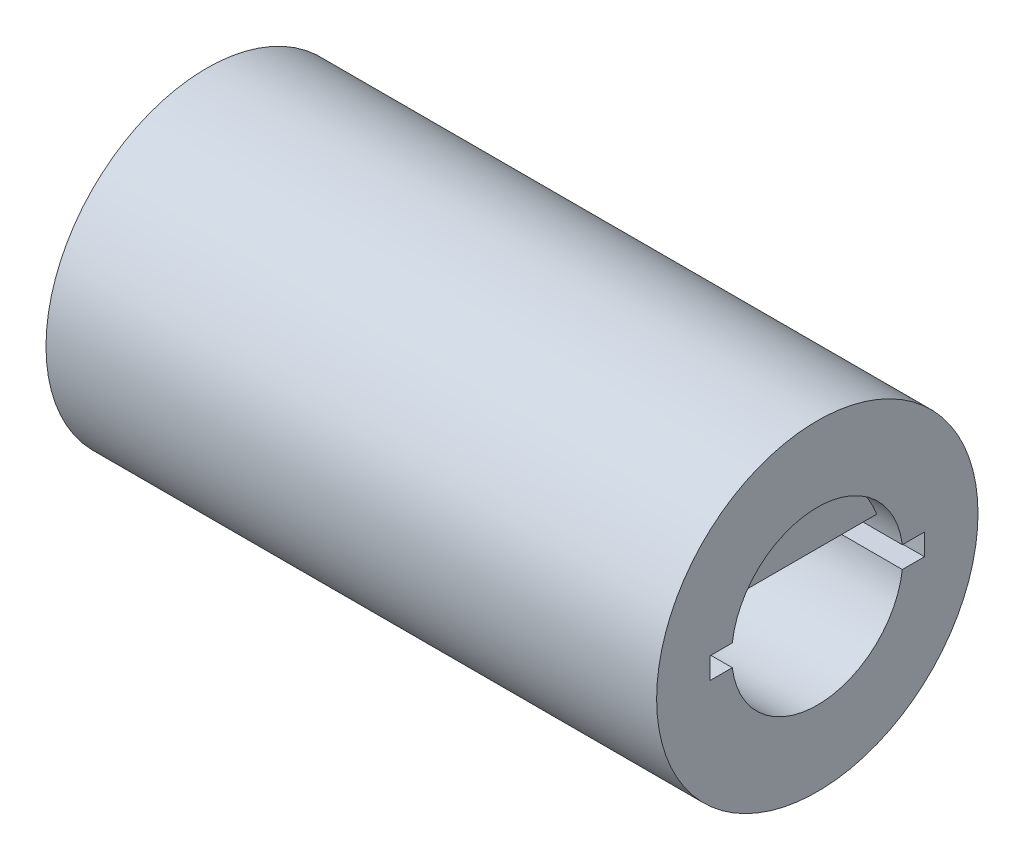
ISO-10303-21;
HEADER;
FILE_DESCRIPTION(('STEP AP214'),'2;1');
FILE_NAME('part.step','',(''),(''),'','','');
FILE_SCHEMA(('AUTOMOTIVE_DESIGN { 1 0 10303 214 1 1 1 1 }'));
ENDSEC;
DATA;
#1=APPLICATION_CONTEXT('core data for automotive mechanical design processes');
#2=APPLICATION_PROTOCOL_DEFINITION('international standard','automotive_design',2000,#1);
#3=PRODUCT_CONTEXT('',#1,'mechanical');
#4=PRODUCT('Part','Part','',(#3));
#5=PRODUCT_RELATED_PRODUCT_CATEGORY('part','',(#4));
#6=PRODUCT_DEFINITION_FORMATION('','',#4);
#7=PRODUCT_DEFINITION_CONTEXT('part definition',#1,'design');
#8=PRODUCT_DEFINITION('design','',#6,#7);
#9=PRODUCT_DEFINITION_SHAPE('','',#8);
#10=(LENGTH_UNIT() NAMED_UNIT(*) SI_UNIT(.MILLI.,.METRE.));
#11=(NAMED_UNIT(*) PLANE_ANGLE_UNIT() SI_UNIT($,.RADIAN.));
#12=(NAMED_UNIT(*) SI_UNIT($,.STERADIAN.) SOLID_ANGLE_UNIT());
#13=UNCERTAINTY_MEASURE_WITH_UNIT(LENGTH_MEASURE(1.E-05),#10,'distance_accuracy_value','');
#14=(GEOMETRIC_REPRESENTATION_CONTEXT(3) GLOBAL_UNCERTAINTY_ASSIGNED_CONTEXT((#13)) GLOBAL_UNIT_ASSIGNED_CONTEXT((#10,
#11,#12)) REPRESENTATION_CONTEXT('',''));
#15=CARTESIAN_POINT('',(0.,0.,0.));
#16=DIRECTION('',(0.,0.,1.));
#17=DIRECTION('',(1.,0.,0.));
#18=AXIS2_PLACEMENT_3D('',#15,#16,#17);
#19=CARTESIAN_POINT('',(8.,0.,0.));
#20=DIRECTION('',(-1.,0.,0.));
#21=DIRECTION('',(0.,0.,1.));
#22=AXIS2_PLACEMENT_3D('',#19,#20,#21);
#23=CYLINDRICAL_SURFACE('',#22,4.);
#24=DIRECTION('',(-1.,0.,0.));
#25=VECTOR('',#24,1.);
#26=CARTESIAN_POINT('',(8.,0.5,-3.96862696659689));
#27=LINE('',#26,#25);
#28=CARTESIAN_POINT('',(8.,0.5,-3.96862696659689));
#29=VERTEX_POINT('',#28);
#30=CARTESIAN_POINT('',(0.,0.5,-3.96862696659689));
#31=VERTEX_POINT('',#30);
#32=EDGE_CURVE('E262',#29,#31,#27,.T.);
#33=ORIENTED_EDGE('',*,*,#32,.F.);
#34=CARTESIAN_POINT('',(8.,0.,0.));
#35=DIRECTION('',(1.,0.,0.));
#36=DIRECTION('',(0.,0.,-1.));
#37=AXIS2_PLACEMENT_3D('',#34,#35,#36);
#38=CIRCLE('',#37,4.);
#39=CARTESIAN_POINT('',(8.,0.5,3.96862696659689));
#40=VERTEX_POINT('',#39);
#41=EDGE_CURVE('E333',#29,#40,#38,.T.);
#42=ORIENTED_EDGE('',*,*,#41,.T.);
#43=DIRECTION('',(-1.,0.,0.));
#44=VECTOR('',#43,1.);
#45=CARTESIAN_POINT('',(8.,0.5,3.96862696659689));
#46=LINE('',#45,#44);
#47=CARTESIAN_POINT('',(0.,0.5,3.96862696659689));
#48=VERTEX_POINT('',#47);
#49=EDGE_CURVE('E260',#48,#40,#46,.F.);
#50=ORIENTED_EDGE('',*,*,#49,.F.);
#51=CARTESIAN_POINT('',(0.,0.,0.));
#52=DIRECTION('',(1.,0.,0.));
#53=DIRECTION('',(0.,0.,-1.));
#54=AXIS2_PLACEMENT_3D('',#51,#52,#53);
#55=CIRCLE('',#54,4.);
#56=CARTESIAN_POINT('',(0.,1.33333333333333,3.77123616632825));
#57=VERTEX_POINT('',#56);
#58=EDGE_CURVE('E235',#57,#48,#55,.T.);
#59=ORIENTED_EDGE('',*,*,#58,.F.);
#60=DIRECTION('',(-1.,0.,0.));
#61=VECTOR('',#60,1.);
#62=CARTESIAN_POINT('',(7.,1.33333333333333,3.77123616632825));
#63=LINE('',#62,#61);
#64=CARTESIAN_POINT('',(7.,1.33333333333333,3.77123616632825));
#65=VERTEX_POINT('',#64);
#66=EDGE_CURVE('E329',#65,#57,#63,.T.);
#67=ORIENTED_EDGE('',*,*,#66,.F.);
#68=CARTESIAN_POINT('',(7.,0.,0.));
#69=DIRECTION('',(1.,0.,0.));
#70=DIRECTION('',(0.,0.,-1.));
#71=AXIS2_PLACEMENT_3D('',#68,#69,#70);
#72=CIRCLE('',#71,4.);
#73=CARTESIAN_POINT('',(7.,1.33333333333333,-3.77123616632825));
#74=VERTEX_POINT('',#73);
#75=EDGE_CURVE('E318',#74,#65,#72,.T.);
#76=ORIENTED_EDGE('',*,*,#75,.F.);
#77=DIRECTION('',(-1.,0.,0.));
#78=VECTOR('',#77,1.);
#79=CARTESIAN_POINT('',(7.,1.33333333333333,-3.77123616632825));
#80=LINE('',#79,#78);
#81=CARTESIAN_POINT('',(0.,1.33333333333333,-3.77123616632825));
#82=VERTEX_POINT('',#81);
#83=EDGE_CURVE('E324',#74,#82,#80,.T.);
#84=ORIENTED_EDGE('',*,*,#83,.T.);
#85=EDGE_CURVE('E332',#31,#82,#55,.T.);
#86=ORIENTED_EDGE('',*,*,#85,.F.);
#87=EDGE_LOOP('',(#33,#42,#50,#59,#67,#76,#84,#86));
#88=FACE_BOUND('',#87,.T.);
#89=ADVANCED_FACE('F40',(#88),#23,.F.);
#90=CARTESIAN_POINT('',(-18.5,0.,0.));
#91=DIRECTION('',(1.,0.,0.));
#92=DIRECTION('',(0.,0.,-1.));
#93=AXIS2_PLACEMENT_3D('',#90,#91,#92);
#94=CYLINDRICAL_SURFACE('',#93,2.5);
#95=CARTESIAN_POINT('',(-1.,0.,0.));
#96=DIRECTION('',(-1.,0.,0.));
#97=DIRECTION('',(0.,0.,1.));
#98=AXIS2_PLACEMENT_3D('',#95,#96,#97);
#99=CIRCLE('',#98,2.5);
#100=CARTESIAN_POINT('',(-1.,-0.648148148148148,-2.41451940933431));
#101=VERTEX_POINT('',#100);
#102=CARTESIAN_POINT('',(-1.,-2.,-1.5));
#103=VERTEX_POINT('',#102);
#104=EDGE_CURVE('E301',#101,#103,#99,.T.);
#105=ORIENTED_EDGE('',*,*,#104,.F.);
#106=DIRECTION('',(1.,0.,0.));
#107=VECTOR('',#106,1.);
#108=CARTESIAN_POINT('',(-18.5,-0.648148148148148,-2.41451940933431));
#109=LINE('',#108,#107);
#110=CARTESIAN_POINT('',(-20.5,-0.648148148148148,-2.41451940933431));
#111=VERTEX_POINT('',#110);
#112=EDGE_CURVE('E350',#101,#111,#109,.F.);
#113=ORIENTED_EDGE('',*,*,#112,.T.);
#114=CARTESIAN_POINT('',(-20.5,0.,0.));
#115=DIRECTION('',(-1.,0.,0.));
#116=DIRECTION('',(0.,0.,1.));
#117=AXIS2_PLACEMENT_3D('',#114,#115,#116);
#118=CIRCLE('',#117,2.5);
#119=CARTESIAN_POINT('',(-20.5,-0.648148148148148,2.41451940933431));
#120=VERTEX_POINT('',#119);
#121=EDGE_CURVE('E296',#111,#120,#118,.T.);
#122=ORIENTED_EDGE('',*,*,#121,.T.);
#123=DIRECTION('',(1.,0.,0.));
#124=VECTOR('',#123,1.);
#125=CARTESIAN_POINT('',(-18.5,-0.648148148148148,2.41451940933431));
#126=LINE('',#125,#124);
#127=CARTESIAN_POINT('',(-1.,-0.648148148148148,2.41451940933431));
#128=VERTEX_POINT('',#127);
#129=EDGE_CURVE('E348',#120,#128,#126,.T.);
#130=ORIENTED_EDGE('',*,*,#129,.T.);
#131=CARTESIAN_POINT('',(-1.,-2.,1.5));
#132=VERTEX_POINT('',#131);
#133=EDGE_CURVE('E307',#132,#128,#99,.T.);
#134=ORIENTED_EDGE('',*,*,#133,.F.);
#135=DIRECTION('',(1.,0.,0.));
#136=VECTOR('',#135,1.);
#137=CARTESIAN_POINT('',(-18.5,-2.,1.5));
#138=LINE('',#137,#136);
#139=CARTESIAN_POINT('',(-18.5,-2.,1.5));
#140=VERTEX_POINT('',#139);
#141=EDGE_CURVE('E314',#140,#132,#138,.T.);
#142=ORIENTED_EDGE('',*,*,#141,.F.);
#143=CARTESIAN_POINT('',(-18.5,0.,0.));
#144=DIRECTION('',(-1.,0.,0.));
#145=DIRECTION('',(0.,0.,1.));
#146=AXIS2_PLACEMENT_3D('',#143,#144,#145);
#147=CIRCLE('',#146,2.5);
#148=CARTESIAN_POINT('',(-18.5,-2.,-1.5));
#149=VERTEX_POINT('',#148);
#150=EDGE_CURVE('E297',#149,#140,#147,.T.);
#151=ORIENTED_EDGE('',*,*,#150,.F.);
#152=DIRECTION('',(1.,0.,0.));
#153=VECTOR('',#152,1.);
#154=CARTESIAN_POINT('',(-18.5,-2.,-1.5));
#155=LINE('',#154,#153);
#156=EDGE_CURVE('E305',#149,#103,#155,.T.);
#157=ORIENTED_EDGE('',*,*,#156,.T.);
#158=EDGE_LOOP('',(#105,#113,#122,#130,#134,#142,#151,#157));
#159=FACE_BOUND('',#158,.T.);
#160=ADVANCED_FACE('F465',(#159),#94,.F.);
#161=DIRECTION('',(-1.,0.,0.));
#162=VECTOR('',#161,1.);
#163=CARTESIAN_POINT('',(8.,-0.5,3.96862696659689));
#164=LINE('',#163,#162);
#165=CARTESIAN_POINT('',(8.,-0.5,3.96862696659689));
#166=VERTEX_POINT('',#165);
#167=CARTESIAN_POINT('',(0.,-0.5,3.96862696659689));
#168=VERTEX_POINT('',#167);
#169=EDGE_CURVE('E258',#166,#168,#164,.T.);
#170=ORIENTED_EDGE('',*,*,#169,.F.);
#171=CARTESIAN_POINT('',(8.,-0.5,-3.96862696659689));
#172=VERTEX_POINT('',#171);
#173=EDGE_CURVE('E337',#166,#172,#38,.T.);
#174=ORIENTED_EDGE('',*,*,#173,.T.);
#175=DIRECTION('',(-1.,0.,0.));
#176=VECTOR('',#175,1.);
#177=CARTESIAN_POINT('',(8.,-0.5,-3.96862696659689));
#178=LINE('',#177,#176);
#179=CARTESIAN_POINT('',(0.,-0.5,-3.96862696659689));
#180=VERTEX_POINT('',#179);
#181=EDGE_CURVE('E255',#180,#172,#178,.F.);
#182=ORIENTED_EDGE('',*,*,#181,.F.);
#183=EDGE_CURVE('E339',#168,#180,#55,.T.);
#184=ORIENTED_EDGE('',*,*,#183,.F.);
#185=EDGE_LOOP('',(#170,#174,#182,#184));
#186=FACE_BOUND('',#185,.T.);
#187=ADVANCED_FACE('F443',(#186),#23,.F.);
#188=CARTESIAN_POINT('',(0.,0.,0.));
#189=DIRECTION('',(-1.,0.,0.));
#190=DIRECTION('',(0.,0.,1.));
#191=AXIS2_PLACEMENT_3D('',#188,#189,#190);
#192=PLANE('',#191);
#193=ORIENTED_EDGE('',*,*,#183,.T.);
#194=DIRECTION('',(0.,0.,-1.));
#195=VECTOR('',#194,1.);
#196=CARTESIAN_POINT('',(0.,-0.5,5.));
#197=LINE('',#196,#195);
#198=CARTESIAN_POINT('',(0.,-0.5,-5.));
#199=VERTEX_POINT('',#198);
#200=EDGE_CURVE('E435',#180,#199,#197,.T.);
#201=ORIENTED_EDGE('',*,*,#200,.T.);
#202=DIRECTION('',(0.,1.,0.));
#203=VECTOR('',#202,1.);
#204=CARTESIAN_POINT('',(0.,-0.5,-5.));
#205=LINE('',#204,#203);
#206=CARTESIAN_POINT('',(0.,0.5,-5.));
#207=VERTEX_POINT('',#206);
#208=EDGE_CURVE('E256',#199,#207,#205,.T.);
#209=ORIENTED_EDGE('',*,*,#208,.T.);
#210=DIRECTION('',(0.,0.,1.));
#211=VECTOR('',#210,1.);
#212=CARTESIAN_POINT('',(0.,0.5,5.));
#213=LINE('',#212,#211);
#214=EDGE_CURVE('E239',#207,#31,#213,.T.);
#215=ORIENTED_EDGE('',*,*,#214,.T.);
#216=ORIENTED_EDGE('',*,*,#85,.T.);
#217=DIRECTION('',(0.,0.,-1.));
#218=VECTOR('',#217,1.);
#219=CARTESIAN_POINT('',(0.,1.33333333333333,3.77123616632825));
#220=LINE('',#219,#218);
#221=EDGE_CURVE('E317',#57,#82,#220,.T.);
#222=ORIENTED_EDGE('',*,*,#221,.F.);
#223=ORIENTED_EDGE('',*,*,#58,.T.);
#224=CARTESIAN_POINT('',(0.,0.5,5.));
#225=VERTEX_POINT('',#224);
#226=EDGE_CURVE('E228',#48,#225,#213,.T.);
#227=ORIENTED_EDGE('',*,*,#226,.T.);
#228=DIRECTION('',(0.,-1.,0.));
#229=VECTOR('',#228,1.);
#230=CARTESIAN_POINT('',(0.,-0.5,5.));
#231=LINE('',#230,#229);
#232=CARTESIAN_POINT('',(0.,-0.5,5.));
#233=VERTEX_POINT('',#232);
#234=EDGE_CURVE('E233',#225,#233,#231,.T.);
#235=ORIENTED_EDGE('',*,*,#234,.T.);
#236=EDGE_CURVE('E434',#233,#168,#197,.T.);
#237=ORIENTED_EDGE('',*,*,#236,.T.);
#238=EDGE_LOOP('',(#193,#201,#209,#215,#216,#222,#223,#227,#235,#237));
#239=FACE_BOUND('',#238,.T.);
#240=ADVANCED_FACE('F231',(#239),#192,.F.);
#241=CARTESIAN_POINT('',(8.,0.,0.));
#242=DIRECTION('',(1.,0.,0.));
#243=DIRECTION('',(0.,0.,-1.));
#244=AXIS2_PLACEMENT_3D('',#241,#242,#243);
#245=PLANE('',#244);
#246=DIRECTION('',(0.,0.,1.));
#247=VECTOR('',#246,1.);
#248=CARTESIAN_POINT('',(8.,0.5,0.));
#249=LINE('',#248,#247);
#250=CARTESIAN_POINT('',(8.,0.5,5.));
#251=VERTEX_POINT('',#250);
#252=EDGE_CURVE('E12',#40,#251,#249,.T.);
#253=ORIENTED_EDGE('',*,*,#252,.F.);
#254=ORIENTED_EDGE('',*,*,#41,.F.);
#255=DIRECTION('',(0.,0.,1.));
#256=VECTOR('',#255,1.);
#257=CARTESIAN_POINT('',(8.,0.5,5.));
#258=LINE('',#257,#256);
#259=CARTESIAN_POINT('',(8.,0.5,-5.));
#260=VERTEX_POINT('',#259);
#261=EDGE_CURVE('E426',#260,#29,#258,.T.);
#262=ORIENTED_EDGE('',*,*,#261,.F.);
#263=DIRECTION('',(0.,1.,0.));
#264=VECTOR('',#263,1.);
#265=CARTESIAN_POINT('',(8.,-0.5,-5.));
#266=LINE('',#265,#264);
#267=CARTESIAN_POINT('',(8.,-0.5,-5.));
#268=VERTEX_POINT('',#267);
#269=EDGE_CURVE('E422',#268,#260,#266,.T.);
#270=ORIENTED_EDGE('',*,*,#269,.F.);
#271=DIRECTION('',(0.,0.,-1.));
#272=VECTOR('',#271,1.);
#273=CARTESIAN_POINT('',(8.,-0.5,0.));
#274=LINE('',#273,#272);
#275=EDGE_CURVE('E48',#172,#268,#274,.T.);
#276=ORIENTED_EDGE('',*,*,#275,.F.);
#277=ORIENTED_EDGE('',*,*,#173,.F.);
#278=DIRECTION('',(0.,0.,-1.));
#279=VECTOR('',#278,1.);
#280=CARTESIAN_POINT('',(8.,-0.5,5.));
#281=LINE('',#280,#279);
#282=CARTESIAN_POINT('',(8.,-0.5,5.));
#283=VERTEX_POINT('',#282);
#284=EDGE_CURVE('E240',#283,#166,#281,.T.);
#285=ORIENTED_EDGE('',*,*,#284,.F.);
#286=DIRECTION('',(0.,-1.,0.));
#287=VECTOR('',#286,1.);
#288=CARTESIAN_POINT('',(8.,-0.5,5.));
#289=LINE('',#288,#287);
#290=EDGE_CURVE('E55',#251,#283,#289,.T.);
#291=ORIENTED_EDGE('',*,*,#290,.F.);
#292=EDGE_LOOP('',(#253,#254,#262,#270,#276,#277,#285,#291));
#293=FACE_BOUND('',#292,.T.);
#294=CARTESIAN_POINT('',(8.,0.,0.));
#295=DIRECTION('',(1.,0.,0.));
#296=DIRECTION('',(0.,0.,-1.));
#297=AXIS2_PLACEMENT_3D('',#294,#295,#296);
#298=CIRCLE('',#297,7.5);
#299=CARTESIAN_POINT('',(8.,0.,-7.5));
#300=VERTEX_POINT('',#299);
#301=EDGE_CURVE('E336',#300,#300,#298,.T.);
#302=ORIENTED_EDGE('',*,*,#301,.T.);
#303=EDGE_LOOP('',(#302));
#304=FACE_BOUND('',#303,.T.);
#305=ADVANCED_FACE('F423',(#293,#304),#245,.T.);
#306=CARTESIAN_POINT('',(8.,0.,0.));
#307=DIRECTION('',(-1.,0.,0.));
#308=DIRECTION('',(0.,0.,1.));
#309=AXIS2_PLACEMENT_3D('',#306,#307,#308);
#310=CYLINDRICAL_SURFACE('',#309,7.5);
#311=ORIENTED_EDGE('',*,*,#301,.F.);
#312=EDGE_LOOP('',(#311));
#313=FACE_BOUND('',#312,.T.);
#314=CARTESIAN_POINT('',(-20.5,0.,0.));
#315=DIRECTION('',(-1.,0.,0.));
#316=DIRECTION('',(0.,0.,1.));
#317=AXIS2_PLACEMENT_3D('',#314,#315,#316);
#318=CIRCLE('',#317,7.5);
#319=CARTESIAN_POINT('',(-20.5,0.,7.5));
#320=VERTEX_POINT('',#319);
#321=EDGE_CURVE('E295',#320,#320,#318,.T.);
#322=ORIENTED_EDGE('',*,*,#321,.F.);
#323=EDGE_LOOP('',(#322));
#324=FACE_BOUND('',#323,.T.);
#325=ADVANCED_FACE('F481',(#313,#324),#310,.T.);
#326=CARTESIAN_POINT('',(7.,1.33333333333333,3.77123616632825));
#327=DIRECTION('',(0.,1.,0.));
#328=DIRECTION('',(0.,0.,1.));
#329=AXIS2_PLACEMENT_3D('',#326,#327,#328);
#330=PLANE('',#329);
#331=ORIENTED_EDGE('',*,*,#221,.T.);
#332=ORIENTED_EDGE('',*,*,#83,.F.);
#333=DIRECTION('',(0.,0.,-1.));
#334=VECTOR('',#333,1.);
#335=CARTESIAN_POINT('',(7.,1.33333333333333,3.77123616632825));
#336=LINE('',#335,#334);
#337=EDGE_CURVE('E321',#65,#74,#336,.T.);
#338=ORIENTED_EDGE('',*,*,#337,.F.);
#339=ORIENTED_EDGE('',*,*,#66,.T.);
#340=EDGE_LOOP('',(#331,#332,#338,#339));
#341=FACE_BOUND('',#340,.T.);
#342=ADVANCED_FACE('F450',(#341),#330,.F.);
#343=CARTESIAN_POINT('',(7.,0.,0.));
#344=DIRECTION('',(1.,0.,0.));
#345=DIRECTION('',(0.,0.,-1.));
#346=AXIS2_PLACEMENT_3D('',#343,#344,#345);
#347=PLANE('',#346);
#348=ORIENTED_EDGE('',*,*,#75,.T.);
#349=ORIENTED_EDGE('',*,*,#337,.T.);
#350=EDGE_LOOP('',(#348,#349));
#351=FACE_BOUND('',#350,.T.);
#352=ADVANCED_FACE('F490',(#351),#347,.T.);
#353=CARTESIAN_POINT('',(-20.5,0.,0.));
#354=DIRECTION('',(-1.,0.,0.));
#355=DIRECTION('',(0.,0.,1.));
#356=AXIS2_PLACEMENT_3D('',#353,#354,#355);
#357=PLANE('',#356);
#358=ORIENTED_EDGE('',*,*,#121,.F.);
#359=CARTESIAN_POINT('',(-20.5,-0.7,-2.60768096208106));
#360=DIRECTION('',(-1.,0.,0.));
#361=DIRECTION('',(0.,0.,1.));
#362=AXIS2_PLACEMENT_3D('',#359,#360,#361);
#363=CIRCLE('',#362,0.2);
#364=CARTESIAN_POINT('',(-20.5,-0.5,-2.60768096208106));
#365=VERTEX_POINT('',#364);
#366=EDGE_CURVE('E358',#111,#365,#363,.T.);
#367=ORIENTED_EDGE('',*,*,#366,.T.);
#368=DIRECTION('',(0.,0.,1.));
#369=VECTOR('',#368,1.);
#370=CARTESIAN_POINT('',(-20.5,-0.5,-3.5));
#371=LINE('',#370,#369);
#372=CARTESIAN_POINT('',(-20.5,-0.5,-3.3));
#373=VERTEX_POINT('',#372);
#374=EDGE_CURVE('E269',#373,#365,#371,.T.);
#375=ORIENTED_EDGE('',*,*,#374,.F.);
#376=CARTESIAN_POINT('',(-20.5,-0.3,-3.3));
#377=DIRECTION('',(-1.,0.,0.));
#378=DIRECTION('',(0.,0.,1.));
#379=AXIS2_PLACEMENT_3D('',#376,#377,#378);
#380=CIRCLE('',#379,0.2);
#381=CARTESIAN_POINT('',(-20.5,-0.3,-3.5));
#382=VERTEX_POINT('',#381);
#383=EDGE_CURVE('E400',#373,#382,#380,.F.);
#384=ORIENTED_EDGE('',*,*,#383,.T.);
#385=DIRECTION('',(0.,-1.,0.));
#386=VECTOR('',#385,1.);
#387=CARTESIAN_POINT('',(-20.5,-0.5,-3.5));
#388=LINE('',#387,#386);
#389=CARTESIAN_POINT('',(-20.5,0.3,-3.5));
#390=VERTEX_POINT('',#389);
#391=EDGE_CURVE('E283',#390,#382,#388,.T.);
#392=ORIENTED_EDGE('',*,*,#391,.F.);
#393=CARTESIAN_POINT('',(-20.5,0.3,-3.3));
#394=DIRECTION('',(-1.,0.,0.));
#395=DIRECTION('',(0.,0.,1.));
#396=AXIS2_PLACEMENT_3D('',#393,#394,#395);
#397=CIRCLE('',#396,0.2);
#398=CARTESIAN_POINT('',(-20.5,0.5,-3.3));
#399=VERTEX_POINT('',#398);
#400=EDGE_CURVE('E404',#390,#399,#397,.F.);
#401=ORIENTED_EDGE('',*,*,#400,.T.);
#402=DIRECTION('',(0.,0.,-1.));
#403=VECTOR('',#402,1.);
#404=CARTESIAN_POINT('',(-20.5,0.5,-3.5));
#405=LINE('',#404,#403);
#406=CARTESIAN_POINT('',(-20.5,0.5,-2.60768096208106));
#407=VERTEX_POINT('',#406);
#408=EDGE_CURVE('E279',#407,#399,#405,.T.);
#409=ORIENTED_EDGE('',*,*,#408,.F.);
#410=CARTESIAN_POINT('',(-20.5,0.7,-2.60768096208106));
#411=DIRECTION('',(-1.,0.,0.));
#412=DIRECTION('',(0.,0.,1.));
#413=AXIS2_PLACEMENT_3D('',#410,#411,#412);
#414=CIRCLE('',#413,0.2);
#415=CARTESIAN_POINT('',(-20.5,0.648148148148148,-2.41451940933431));
#416=VERTEX_POINT('',#415);
#417=EDGE_CURVE('E356',#407,#416,#414,.T.);
#418=ORIENTED_EDGE('',*,*,#417,.T.);
#419=CARTESIAN_POINT('',(-20.5,0.648148148148148,2.41451940933431));
#420=VERTEX_POINT('',#419);
#421=EDGE_CURVE('E292',#420,#416,#118,.T.);
#422=ORIENTED_EDGE('',*,*,#421,.F.);
#423=CARTESIAN_POINT('',(-20.5,0.7,2.60768096208106));
#424=DIRECTION('',(-1.,0.,0.));
#425=DIRECTION('',(0.,0.,1.));
#426=AXIS2_PLACEMENT_3D('',#423,#424,#425);
#427=CIRCLE('',#426,0.2);
#428=CARTESIAN_POINT('',(-20.5,0.5,2.60768096208106));
#429=VERTEX_POINT('',#428);
#430=EDGE_CURVE('E354',#420,#429,#427,.T.);
#431=ORIENTED_EDGE('',*,*,#430,.T.);
#432=CARTESIAN_POINT('',(-20.5,0.5,3.3));
#433=VERTEX_POINT('',#432);
#434=EDGE_CURVE('E280',#433,#429,#405,.T.);
#435=ORIENTED_EDGE('',*,*,#434,.F.);
#436=CARTESIAN_POINT('',(-20.5,0.3,3.3));
#437=DIRECTION('',(-1.,0.,0.));
#438=DIRECTION('',(0.,0.,1.));
#439=AXIS2_PLACEMENT_3D('',#436,#437,#438);
#440=CIRCLE('',#439,0.2);
#441=CARTESIAN_POINT('',(-20.5,0.3,3.5));
#442=VERTEX_POINT('',#441);
#443=EDGE_CURVE('E412',#433,#442,#440,.F.);
#444=ORIENTED_EDGE('',*,*,#443,.T.);
#445=DIRECTION('',(0.,1.,0.));
#446=VECTOR('',#445,1.);
#447=CARTESIAN_POINT('',(-20.5,-0.5,3.5));
#448=LINE('',#447,#446);
#449=CARTESIAN_POINT('',(-20.5,-0.3,3.5));
#450=VERTEX_POINT('',#449);
#451=EDGE_CURVE('E264',#450,#442,#448,.T.);
#452=ORIENTED_EDGE('',*,*,#451,.F.);
#453=CARTESIAN_POINT('',(-20.5,-0.3,3.3));
#454=DIRECTION('',(-1.,0.,0.));
#455=DIRECTION('',(0.,0.,1.));
#456=AXIS2_PLACEMENT_3D('',#453,#454,#455);
#457=CIRCLE('',#456,0.2);
#458=CARTESIAN_POINT('',(-20.5,-0.5,3.3));
#459=VERTEX_POINT('',#458);
#460=EDGE_CURVE('E410',#450,#459,#457,.F.);
#461=ORIENTED_EDGE('',*,*,#460,.T.);
#462=CARTESIAN_POINT('',(-20.5,-0.5,2.60768096208106));
#463=VERTEX_POINT('',#462);
#464=EDGE_CURVE('E286',#463,#459,#371,.T.);
#465=ORIENTED_EDGE('',*,*,#464,.F.);
#466=CARTESIAN_POINT('',(-20.5,-0.7,2.60768096208106));
#467=DIRECTION('',(-1.,0.,0.));
#468=DIRECTION('',(0.,0.,1.));
#469=AXIS2_PLACEMENT_3D('',#466,#467,#468);
#470=CIRCLE('',#469,0.2);
#471=EDGE_CURVE('E352',#463,#120,#470,.T.);
#472=ORIENTED_EDGE('',*,*,#471,.T.);
#473=EDGE_LOOP('',(#358,#367,#375,#384,#392,#401,#409,#418,#422,#431,#435,#444,#452,#461,#465,#472));
#474=FACE_BOUND('',#473,.T.);
#475=ORIENTED_EDGE('',*,*,#321,.T.);
#476=EDGE_LOOP('',(#475));
#477=FACE_BOUND('',#476,.T.);
#478=ADVANCED_FACE('F492',(#474,#477),#357,.T.);
#479=CARTESIAN_POINT('',(-18.5,0.,0.));
#480=DIRECTION('',(-1.,0.,0.));
#481=DIRECTION('',(0.,0.,1.));
#482=AXIS2_PLACEMENT_3D('',#479,#480,#481);
#483=PLANE('',#482);
#484=DIRECTION('',(0.,0.,1.));
#485=VECTOR('',#484,1.);
#486=CARTESIAN_POINT('',(-18.5,-2.,0.));
#487=LINE('',#486,#485);
#488=EDGE_CURVE('E302',#149,#140,#487,.T.);
#489=ORIENTED_EDGE('',*,*,#488,.F.);
#490=ORIENTED_EDGE('',*,*,#150,.T.);
#491=EDGE_LOOP('',(#489,#490));
#492=FACE_BOUND('',#491,.T.);
#493=ADVANCED_FACE('F500',(#492),#483,.T.);
#494=CARTESIAN_POINT('',(-18.5,-2.,0.));
#495=DIRECTION('',(0.,1.,0.));
#496=DIRECTION('',(0.,0.,1.));
#497=AXIS2_PLACEMENT_3D('',#494,#495,#496);
#498=PLANE('',#497);
#499=DIRECTION('',(0.,0.,1.));
#500=VECTOR('',#499,1.);
#501=CARTESIAN_POINT('',(-1.,-2.,0.));
#502=LINE('',#501,#500);
#503=EDGE_CURVE('E306',#103,#132,#502,.T.);
#504=ORIENTED_EDGE('',*,*,#503,.F.);
#505=ORIENTED_EDGE('',*,*,#156,.F.);
#506=ORIENTED_EDGE('',*,*,#488,.T.);
#507=ORIENTED_EDGE('',*,*,#141,.T.);
#508=EDGE_LOOP('',(#504,#505,#506,#507));
#509=FACE_BOUND('',#508,.T.);
#510=ADVANCED_FACE('F486',(#509),#498,.T.);
#511=CARTESIAN_POINT('',(-1.,0.,0.));
#512=DIRECTION('',(-1.,0.,0.));
#513=DIRECTION('',(0.,0.,1.));
#514=AXIS2_PLACEMENT_3D('',#511,#512,#513);
#515=PLANE('',#514);
#516=DIRECTION('',(0.,1.,0.));
#517=VECTOR('',#516,1.);
#518=CARTESIAN_POINT('',(-1.,-0.5,-3.5));
#519=LINE('',#518,#517);
#520=CARTESIAN_POINT('',(-1.,-0.3,-3.5));
#521=VERTEX_POINT('',#520);
#522=CARTESIAN_POINT('',(-1.,0.3,-3.5));
#523=VERTEX_POINT('',#522);
#524=EDGE_CURVE('E265',#521,#523,#519,.T.);
#525=ORIENTED_EDGE('',*,*,#524,.F.);
#526=CARTESIAN_POINT('',(-1.,-0.3,-3.3));
#527=DIRECTION('',(-1.,0.,0.));
#528=DIRECTION('',(0.,0.,1.));
#529=AXIS2_PLACEMENT_3D('',#526,#527,#528);
#530=CIRCLE('',#529,0.2);
#531=CARTESIAN_POINT('',(-1.,-0.5,-3.3));
#532=VERTEX_POINT('',#531);
#533=EDGE_CURVE('E371',#521,#532,#530,.T.);
#534=ORIENTED_EDGE('',*,*,#533,.T.);
#535=DIRECTION('',(0.,0.,-1.));
#536=VECTOR('',#535,1.);
#537=CARTESIAN_POINT('',(-1.,-0.5,-3.5));
#538=LINE('',#537,#536);
#539=CARTESIAN_POINT('',(-1.,-0.5,-2.60768096208106));
#540=VERTEX_POINT('',#539);
#541=EDGE_CURVE('E268',#540,#532,#538,.T.);
#542=ORIENTED_EDGE('',*,*,#541,.F.);
#543=CARTESIAN_POINT('',(-1.,-0.7,-2.60768096208106));
#544=DIRECTION('',(-1.,0.,0.));
#545=DIRECTION('',(0.,0.,1.));
#546=AXIS2_PLACEMENT_3D('',#543,#544,#545);
#547=CIRCLE('',#546,0.2);
#548=EDGE_CURVE('E398',#540,#101,#547,.F.);
#549=ORIENTED_EDGE('',*,*,#548,.T.);
#550=ORIENTED_EDGE('',*,*,#104,.T.);
#551=ORIENTED_EDGE('',*,*,#503,.T.);
#552=ORIENTED_EDGE('',*,*,#133,.T.);
#553=CARTESIAN_POINT('',(-1.,-0.7,2.60768096208106));
#554=DIRECTION('',(-1.,0.,0.));
#555=DIRECTION('',(0.,0.,1.));
#556=AXIS2_PLACEMENT_3D('',#553,#554,#555);
#557=CIRCLE('',#556,0.2);
#558=CARTESIAN_POINT('',(-1.,-0.5,2.60768096208106));
#559=VERTEX_POINT('',#558);
#560=EDGE_CURVE('E408',#128,#559,#557,.F.);
#561=ORIENTED_EDGE('',*,*,#560,.T.);
#562=CARTESIAN_POINT('',(-1.,-0.5,3.3));
#563=VERTEX_POINT('',#562);
#564=EDGE_CURVE('E270',#563,#559,#538,.T.);
#565=ORIENTED_EDGE('',*,*,#564,.F.);
#566=CARTESIAN_POINT('',(-1.,-0.3,3.3));
#567=DIRECTION('',(-1.,0.,0.));
#568=DIRECTION('',(0.,0.,1.));
#569=AXIS2_PLACEMENT_3D('',#566,#567,#568);
#570=CIRCLE('',#569,0.2);
#571=CARTESIAN_POINT('',(-1.,-0.3,3.5));
#572=VERTEX_POINT('',#571);
#573=EDGE_CURVE('E367',#563,#572,#570,.T.);
#574=ORIENTED_EDGE('',*,*,#573,.T.);
#575=DIRECTION('',(0.,-1.,0.));
#576=VECTOR('',#575,1.);
#577=CARTESIAN_POINT('',(-1.,-0.5,3.5));
#578=LINE('',#577,#576);
#579=CARTESIAN_POINT('',(-1.,0.3,3.5));
#580=VERTEX_POINT('',#579);
#581=EDGE_CURVE('E273',#580,#572,#578,.T.);
#582=ORIENTED_EDGE('',*,*,#581,.F.);
#583=CARTESIAN_POINT('',(-1.,0.3,3.3));
#584=DIRECTION('',(-1.,0.,0.));
#585=DIRECTION('',(0.,0.,1.));
#586=AXIS2_PLACEMENT_3D('',#583,#584,#585);
#587=CIRCLE('',#586,0.2);
#588=CARTESIAN_POINT('',(-1.,0.5,3.3));
#589=VERTEX_POINT('',#588);
#590=EDGE_CURVE('E365',#580,#589,#587,.T.);
#591=ORIENTED_EDGE('',*,*,#590,.T.);
#592=DIRECTION('',(0.,0.,1.));
#593=VECTOR('',#592,1.);
#594=CARTESIAN_POINT('',(-1.,0.5,-3.5));
#595=LINE('',#594,#593);
#596=CARTESIAN_POINT('',(-1.,0.5,2.60768096208106));
#597=VERTEX_POINT('',#596);
#598=EDGE_CURVE('E276',#597,#589,#595,.T.);
#599=ORIENTED_EDGE('',*,*,#598,.F.);
#600=CARTESIAN_POINT('',(-1.,0.7,2.60768096208106));
#601=DIRECTION('',(-1.,0.,0.));
#602=DIRECTION('',(0.,0.,1.));
#603=AXIS2_PLACEMENT_3D('',#600,#601,#602);
#604=CIRCLE('',#603,0.2);
#605=CARTESIAN_POINT('',(-1.,0.648148148148148,2.41451940933431));
#606=VERTEX_POINT('',#605);
#607=EDGE_CURVE('E406',#597,#606,#604,.F.);
#608=ORIENTED_EDGE('',*,*,#607,.T.);
#609=CARTESIAN_POINT('',(-1.,0.648148148148148,-2.41451940933431));
#610=VERTEX_POINT('',#609);
#611=EDGE_CURVE('E310',#606,#610,#99,.T.);
#612=ORIENTED_EDGE('',*,*,#611,.T.);
#613=CARTESIAN_POINT('',(-1.,0.7,-2.60768096208106));
#614=DIRECTION('',(-1.,0.,0.));
#615=DIRECTION('',(0.,0.,1.));
#616=AXIS2_PLACEMENT_3D('',#613,#614,#615);
#617=CIRCLE('',#616,0.2);
#618=CARTESIAN_POINT('',(-1.,0.5,-2.60768096208106));
#619=VERTEX_POINT('',#618);
#620=EDGE_CURVE('E402',#610,#619,#617,.F.);
#621=ORIENTED_EDGE('',*,*,#620,.T.);
#622=CARTESIAN_POINT('',(-1.,0.5,-3.3));
#623=VERTEX_POINT('',#622);
#624=EDGE_CURVE('E291',#623,#619,#595,.T.);
#625=ORIENTED_EDGE('',*,*,#624,.F.);
#626=CARTESIAN_POINT('',(-1.,0.3,-3.3));
#627=DIRECTION('',(-1.,0.,0.));
#628=DIRECTION('',(0.,0.,1.));
#629=AXIS2_PLACEMENT_3D('',#626,#627,#628);
#630=CIRCLE('',#629,0.2);
#631=EDGE_CURVE('E369',#623,#523,#630,.T.);
#632=ORIENTED_EDGE('',*,*,#631,.T.);
#633=EDGE_LOOP('',(#525,#534,#542,#549,#550,#551,#552,#561,#565,#574,#582,#591,#599,#608,#612,
#621,#625,#632));
#634=FACE_BOUND('',#633,.T.);
#635=ADVANCED_FACE('F483',(#634),#515,.T.);
#636=ORIENTED_EDGE('',*,*,#421,.T.);
#637=DIRECTION('',(1.,0.,0.));
#638=VECTOR('',#637,1.);
#639=CARTESIAN_POINT('',(-18.5,0.648148148148148,-2.41451940933431));
#640=LINE('',#639,#638);
#641=EDGE_CURVE('E380',#416,#610,#640,.T.);
#642=ORIENTED_EDGE('',*,*,#641,.T.);
#643=ORIENTED_EDGE('',*,*,#611,.F.);
#644=DIRECTION('',(1.,0.,0.));
#645=VECTOR('',#644,1.);
#646=CARTESIAN_POINT('',(-18.5,0.648148148148148,2.41451940933431));
#647=LINE('',#646,#645);
#648=EDGE_CURVE('E378',#606,#420,#647,.F.);
#649=ORIENTED_EDGE('',*,*,#648,.T.);
#650=EDGE_LOOP('',(#636,#642,#643,#649));
#651=FACE_BOUND('',#650,.T.);
#652=ADVANCED_FACE('F473',(#651),#94,.F.);
#653=CARTESIAN_POINT('',(6.07106781186548,0.5,-3.5));
#654=DIRECTION('',(0.,1.,0.));
#655=DIRECTION('',(0.,0.,1.));
#656=AXIS2_PLACEMENT_3D('',#653,#654,#655);
#657=PLANE('',#656);
#658=ORIENTED_EDGE('',*,*,#434,.T.);
#659=DIRECTION('',(-1.,0.,0.));
#660=VECTOR('',#659,1.);
#661=CARTESIAN_POINT('',(-1.,0.5,2.60768096208106));
#662=LINE('',#661,#660);
#663=EDGE_CURVE('E385',#429,#597,#662,.F.);
#664=ORIENTED_EDGE('',*,*,#663,.T.);
#665=ORIENTED_EDGE('',*,*,#598,.T.);
#666=DIRECTION('',(-1.,0.,0.));
#667=VECTOR('',#666,1.);
#668=CARTESIAN_POINT('',(-20.5,0.5,3.3));
#669=LINE('',#668,#667);
#670=EDGE_CURVE('E382',#589,#433,#669,.T.);
#671=ORIENTED_EDGE('',*,*,#670,.T.);
#672=EDGE_LOOP('',(#658,#664,#665,#671));
#673=FACE_BOUND('',#672,.T.);
#674=ADVANCED_FACE('F496',(#673),#657,.F.);
#675=CARTESIAN_POINT('',(6.07106781186548,-0.5,-3.5));
#676=DIRECTION('',(0.,-1.,0.));
#677=DIRECTION('',(0.,0.,-1.));
#678=AXIS2_PLACEMENT_3D('',#675,#676,#677);
#679=PLANE('',#678);
#680=ORIENTED_EDGE('',*,*,#564,.T.);
#681=DIRECTION('',(-1.,0.,0.));
#682=VECTOR('',#681,1.);
#683=CARTESIAN_POINT('',(-20.5,-0.5,2.60768096208106));
#684=LINE('',#683,#682);
#685=EDGE_CURVE('E390',#559,#463,#684,.T.);
#686=ORIENTED_EDGE('',*,*,#685,.T.);
#687=ORIENTED_EDGE('',*,*,#464,.T.);
#688=DIRECTION('',(-1.,0.,0.));
#689=VECTOR('',#688,1.);
#690=CARTESIAN_POINT('',(-1.,-0.5,3.3));
#691=LINE('',#690,#689);
#692=EDGE_CURVE('E388',#459,#563,#691,.F.);
#693=ORIENTED_EDGE('',*,*,#692,.T.);
#694=EDGE_LOOP('',(#680,#686,#687,#693));
#695=FACE_BOUND('',#694,.T.);
#696=ADVANCED_FACE('F512',(#695),#679,.F.);
#697=CARTESIAN_POINT('',(6.07106781186548,-0.5,3.5));
#698=DIRECTION('',(0.,0.,1.));
#699=DIRECTION('',(1.,0.,0.));
#700=AXIS2_PLACEMENT_3D('',#697,#698,#699);
#701=PLANE('',#700);
#702=ORIENTED_EDGE('',*,*,#581,.T.);
#703=DIRECTION('',(-1.,0.,0.));
#704=VECTOR('',#703,1.);
#705=CARTESIAN_POINT('',(-20.5,-0.3,3.5));
#706=LINE('',#705,#704);
#707=EDGE_CURVE('E395',#572,#450,#706,.T.);
#708=ORIENTED_EDGE('',*,*,#707,.T.);
#709=ORIENTED_EDGE('',*,*,#451,.T.);
#710=DIRECTION('',(-1.,0.,0.));
#711=VECTOR('',#710,1.);
#712=CARTESIAN_POINT('',(-1.,0.3,3.5));
#713=LINE('',#712,#711);
#714=EDGE_CURVE('E393',#442,#580,#713,.F.);
#715=ORIENTED_EDGE('',*,*,#714,.T.);
#716=EDGE_LOOP('',(#702,#708,#709,#715));
#717=FACE_BOUND('',#716,.T.);
#718=ADVANCED_FACE('F508',(#717),#701,.F.);
#719=ORIENTED_EDGE('',*,*,#374,.T.);
#720=DIRECTION('',(-1.,0.,0.));
#721=VECTOR('',#720,1.);
#722=CARTESIAN_POINT('',(-1.,-0.5,-2.60768096208106));
#723=LINE('',#722,#721);
#724=EDGE_CURVE('E345',#365,#540,#723,.F.);
#725=ORIENTED_EDGE('',*,*,#724,.T.);
#726=ORIENTED_EDGE('',*,*,#541,.T.);
#727=DIRECTION('',(-1.,0.,0.));
#728=VECTOR('',#727,1.);
#729=CARTESIAN_POINT('',(-20.5,-0.5,-3.3));
#730=LINE('',#729,#728);
#731=EDGE_CURVE('E342',#532,#373,#730,.T.);
#732=ORIENTED_EDGE('',*,*,#731,.T.);
#733=EDGE_LOOP('',(#719,#725,#726,#732));
#734=FACE_BOUND('',#733,.T.);
#735=ADVANCED_FACE('F511',(#734),#679,.F.);
#736=CARTESIAN_POINT('',(6.07106781186548,-0.5,-3.5));
#737=DIRECTION('',(0.,0.,-1.));
#738=DIRECTION('',(-1.,0.,0.));
#739=AXIS2_PLACEMENT_3D('',#736,#737,#738);
#740=PLANE('',#739);
#741=ORIENTED_EDGE('',*,*,#391,.T.);
#742=DIRECTION('',(-1.,0.,0.));
#743=VECTOR('',#742,1.);
#744=CARTESIAN_POINT('',(-1.,-0.3,-3.5));
#745=LINE('',#744,#743);
#746=EDGE_CURVE('E363',#382,#521,#745,.F.);
#747=ORIENTED_EDGE('',*,*,#746,.T.);
#748=ORIENTED_EDGE('',*,*,#524,.T.);
#749=DIRECTION('',(-1.,0.,0.));
#750=VECTOR('',#749,1.);
#751=CARTESIAN_POINT('',(-20.5,0.3,-3.5));
#752=LINE('',#751,#750);
#753=EDGE_CURVE('E360',#523,#390,#752,.T.);
#754=ORIENTED_EDGE('',*,*,#753,.T.);
#755=EDGE_LOOP('',(#741,#747,#748,#754));
#756=FACE_BOUND('',#755,.T.);
#757=ADVANCED_FACE('F518',(#756),#740,.F.);
#758=ORIENTED_EDGE('',*,*,#624,.T.);
#759=DIRECTION('',(-1.,0.,0.));
#760=VECTOR('',#759,1.);
#761=CARTESIAN_POINT('',(-20.5,0.5,-2.60768096208106));
#762=LINE('',#761,#760);
#763=EDGE_CURVE('E375',#619,#407,#762,.T.);
#764=ORIENTED_EDGE('',*,*,#763,.T.);
#765=ORIENTED_EDGE('',*,*,#408,.T.);
#766=DIRECTION('',(-1.,0.,0.));
#767=VECTOR('',#766,1.);
#768=CARTESIAN_POINT('',(-1.,0.5,-3.3));
#769=LINE('',#768,#767);
#770=EDGE_CURVE('E373',#399,#623,#769,.F.);
#771=ORIENTED_EDGE('',*,*,#770,.T.);
#772=EDGE_LOOP('',(#758,#764,#765,#771));
#773=FACE_BOUND('',#772,.T.);
#774=ADVANCED_FACE('F514',(#773),#657,.F.);
#775=CARTESIAN_POINT('',(-18.5,-0.7,-2.60768096208106));
#776=DIRECTION('',(1.,0.,0.));
#777=DIRECTION('',(0.,0.,-1.));
#778=AXIS2_PLACEMENT_3D('',#775,#776,#777);
#779=CYLINDRICAL_SURFACE('',#778,0.2);
#780=ORIENTED_EDGE('',*,*,#366,.F.);
#781=ORIENTED_EDGE('',*,*,#112,.F.);
#782=ORIENTED_EDGE('',*,*,#548,.F.);
#783=ORIENTED_EDGE('',*,*,#724,.F.);
#784=EDGE_LOOP('',(#780,#781,#782,#783));
#785=FACE_BOUND('',#784,.T.);
#786=ADVANCED_FACE('F517',(#785),#779,.T.);
#787=CARTESIAN_POINT('',(6.07106781186548,-0.3,-3.3));
#788=DIRECTION('',(1.,0.,0.));
#789=DIRECTION('',(0.,0.,-1.));
#790=AXIS2_PLACEMENT_3D('',#787,#788,#789);
#791=CYLINDRICAL_SURFACE('',#790,0.2);
#792=ORIENTED_EDGE('',*,*,#533,.F.);
#793=ORIENTED_EDGE('',*,*,#746,.F.);
#794=ORIENTED_EDGE('',*,*,#383,.F.);
#795=ORIENTED_EDGE('',*,*,#731,.F.);
#796=EDGE_LOOP('',(#792,#793,#794,#795));
#797=FACE_BOUND('',#796,.T.);
#798=ADVANCED_FACE('F622',(#797),#791,.F.);
#799=CARTESIAN_POINT('',(-18.5,0.7,-2.60768096208106));
#800=DIRECTION('',(1.,0.,0.));
#801=DIRECTION('',(0.,0.,-1.));
#802=AXIS2_PLACEMENT_3D('',#799,#800,#801);
#803=CYLINDRICAL_SURFACE('',#802,0.2);
#804=ORIENTED_EDGE('',*,*,#620,.F.);
#805=ORIENTED_EDGE('',*,*,#641,.F.);
#806=ORIENTED_EDGE('',*,*,#417,.F.);
#807=ORIENTED_EDGE('',*,*,#763,.F.);
#808=EDGE_LOOP('',(#804,#805,#806,#807));
#809=FACE_BOUND('',#808,.T.);
#810=ADVANCED_FACE('F612',(#809),#803,.T.);
#811=CARTESIAN_POINT('',(6.07106781186548,0.3,-3.3));
#812=DIRECTION('',(1.,0.,0.));
#813=DIRECTION('',(0.,0.,-1.));
#814=AXIS2_PLACEMENT_3D('',#811,#812,#813);
#815=CYLINDRICAL_SURFACE('',#814,0.2);
#816=ORIENTED_EDGE('',*,*,#631,.F.);
#817=ORIENTED_EDGE('',*,*,#770,.F.);
#818=ORIENTED_EDGE('',*,*,#400,.F.);
#819=ORIENTED_EDGE('',*,*,#753,.F.);
#820=EDGE_LOOP('',(#816,#817,#818,#819));
#821=FACE_BOUND('',#820,.T.);
#822=ADVANCED_FACE('F602',(#821),#815,.F.);
#823=CARTESIAN_POINT('',(-18.5,0.7,2.60768096208106));
#824=DIRECTION('',(1.,0.,0.));
#825=DIRECTION('',(0.,0.,-1.));
#826=AXIS2_PLACEMENT_3D('',#823,#824,#825);
#827=CYLINDRICAL_SURFACE('',#826,0.2);
#828=ORIENTED_EDGE('',*,*,#430,.F.);
#829=ORIENTED_EDGE('',*,*,#648,.F.);
#830=ORIENTED_EDGE('',*,*,#607,.F.);
#831=ORIENTED_EDGE('',*,*,#663,.F.);
#832=EDGE_LOOP('',(#828,#829,#830,#831));
#833=FACE_BOUND('',#832,.T.);
#834=ADVANCED_FACE('F592',(#833),#827,.T.);
#835=CARTESIAN_POINT('',(-18.5,-0.7,2.60768096208106));
#836=DIRECTION('',(1.,0.,0.));
#837=DIRECTION('',(0.,0.,-1.));
#838=AXIS2_PLACEMENT_3D('',#835,#836,#837);
#839=CYLINDRICAL_SURFACE('',#838,0.2);
#840=ORIENTED_EDGE('',*,*,#560,.F.);
#841=ORIENTED_EDGE('',*,*,#129,.F.);
#842=ORIENTED_EDGE('',*,*,#471,.F.);
#843=ORIENTED_EDGE('',*,*,#685,.F.);
#844=EDGE_LOOP('',(#840,#841,#842,#843));
#845=FACE_BOUND('',#844,.T.);
#846=ADVANCED_FACE('F583',(#845),#839,.T.);
#847=CARTESIAN_POINT('',(6.07106781186548,-0.3,3.3));
#848=DIRECTION('',(1.,0.,0.));
#849=DIRECTION('',(0.,0.,-1.));
#850=AXIS2_PLACEMENT_3D('',#847,#848,#849);
#851=CYLINDRICAL_SURFACE('',#850,0.2);
#852=ORIENTED_EDGE('',*,*,#573,.F.);
#853=ORIENTED_EDGE('',*,*,#692,.F.);
#854=ORIENTED_EDGE('',*,*,#460,.F.);
#855=ORIENTED_EDGE('',*,*,#707,.F.);
#856=EDGE_LOOP('',(#852,#853,#854,#855));
#857=FACE_BOUND('',#856,.T.);
#858=ADVANCED_FACE('F462',(#857),#851,.F.);
#859=CARTESIAN_POINT('',(6.07106781186548,0.3,3.3));
#860=DIRECTION('',(1.,0.,0.));
#861=DIRECTION('',(0.,0.,-1.));
#862=AXIS2_PLACEMENT_3D('',#859,#860,#861);
#863=CYLINDRICAL_SURFACE('',#862,0.2);
#864=ORIENTED_EDGE('',*,*,#590,.F.);
#865=ORIENTED_EDGE('',*,*,#714,.F.);
#866=ORIENTED_EDGE('',*,*,#443,.F.);
#867=ORIENTED_EDGE('',*,*,#670,.F.);
#868=EDGE_LOOP('',(#864,#865,#866,#867));
#869=FACE_BOUND('',#868,.T.);
#870=ADVANCED_FACE('F42',(#869),#863,.F.);
#871=CARTESIAN_POINT('',(-10.0498756211209,-0.5,-5.));
#872=DIRECTION('',(0.,0.,-1.));
#873=DIRECTION('',(-1.,0.,0.));
#874=AXIS2_PLACEMENT_3D('',#871,#872,#873);
#875=PLANE('',#874);
#876=DIRECTION('',(1.,0.,0.));
#877=VECTOR('',#876,1.);
#878=CARTESIAN_POINT('',(-10.0498756211209,-0.5,-5.));
#879=LINE('',#878,#877);
#880=EDGE_CURVE('E63',#199,#268,#879,.T.);
#881=ORIENTED_EDGE('',*,*,#880,.T.);
#882=ORIENTED_EDGE('',*,*,#269,.T.);
#883=DIRECTION('',(1.,0.,0.));
#884=VECTOR('',#883,1.);
#885=CARTESIAN_POINT('',(-10.0498756211209,0.5,-5.));
#886=LINE('',#885,#884);
#887=EDGE_CURVE('E253',#207,#260,#886,.T.);
#888=ORIENTED_EDGE('',*,*,#887,.F.);
#889=ORIENTED_EDGE('',*,*,#208,.F.);
#890=EDGE_LOOP('',(#881,#882,#888,#889));
#891=FACE_BOUND('',#890,.T.);
#892=ADVANCED_FACE('F453',(#891),#875,.F.);
#893=CARTESIAN_POINT('',(-10.0498756211209,-0.5,5.));
#894=DIRECTION('',(0.,-1.,0.));
#895=DIRECTION('',(0.,0.,-1.));
#896=AXIS2_PLACEMENT_3D('',#893,#894,#895);
#897=PLANE('',#896);
#898=ORIENTED_EDGE('',*,*,#181,.T.);
#899=ORIENTED_EDGE('',*,*,#275,.T.);
#900=ORIENTED_EDGE('',*,*,#880,.F.);
#901=ORIENTED_EDGE('',*,*,#200,.F.);
#902=EDGE_LOOP('',(#898,#899,#900,#901));
#903=FACE_BOUND('',#902,.T.);
#904=ADVANCED_FACE('F416',(#903),#897,.F.);
#905=CARTESIAN_POINT('',(-10.0498756211209,0.5,5.));
#906=DIRECTION('',(0.,1.,0.));
#907=DIRECTION('',(0.,0.,1.));
#908=AXIS2_PLACEMENT_3D('',#905,#906,#907);
#909=PLANE('',#908);
#910=ORIENTED_EDGE('',*,*,#32,.T.);
#911=ORIENTED_EDGE('',*,*,#214,.F.);
#912=ORIENTED_EDGE('',*,*,#887,.T.);
#913=ORIENTED_EDGE('',*,*,#261,.T.);
#914=EDGE_LOOP('',(#910,#911,#912,#913));
#915=FACE_BOUND('',#914,.T.);
#916=ADVANCED_FACE('F452',(#915),#909,.F.);
#917=ORIENTED_EDGE('',*,*,#169,.T.);
#918=ORIENTED_EDGE('',*,*,#236,.F.);
#919=DIRECTION('',(1.,0.,0.));
#920=VECTOR('',#919,1.);
#921=CARTESIAN_POINT('',(-10.0498756211209,-0.5,5.));
#922=LINE('',#921,#920);
#923=EDGE_CURVE('E244',#233,#283,#922,.T.);
#924=ORIENTED_EDGE('',*,*,#923,.T.);
#925=ORIENTED_EDGE('',*,*,#284,.T.);
#926=EDGE_LOOP('',(#917,#918,#924,#925));
#927=FACE_BOUND('',#926,.T.);
#928=ADVANCED_FACE('F439',(#927),#897,.F.);
#929=ORIENTED_EDGE('',*,*,#49,.T.);
#930=ORIENTED_EDGE('',*,*,#252,.T.);
#931=DIRECTION('',(1.,0.,0.));
#932=VECTOR('',#931,1.);
#933=CARTESIAN_POINT('',(-10.0498756211209,0.5,5.));
#934=LINE('',#933,#932);
#935=EDGE_CURVE('E243',#225,#251,#934,.T.);
#936=ORIENTED_EDGE('',*,*,#935,.F.);
#937=ORIENTED_EDGE('',*,*,#226,.F.);
#938=EDGE_LOOP('',(#929,#930,#936,#937));
#939=FACE_BOUND('',#938,.T.);
#940=ADVANCED_FACE('F246',(#939),#909,.F.);
#941=CARTESIAN_POINT('',(-10.0498756211209,-0.5,5.));
#942=DIRECTION('',(0.,0.,1.));
#943=DIRECTION('',(1.,0.,0.));
#944=AXIS2_PLACEMENT_3D('',#941,#942,#943);
#945=PLANE('',#944);
#946=ORIENTED_EDGE('',*,*,#935,.T.);
#947=ORIENTED_EDGE('',*,*,#290,.T.);
#948=ORIENTED_EDGE('',*,*,#923,.F.);
#949=ORIENTED_EDGE('',*,*,#234,.F.);
#950=EDGE_LOOP('',(#946,#947,#948,#949));
#951=FACE_BOUND('',#950,.T.);
#952=ADVANCED_FACE('F242',(#951),#945,.F.);
#953=CLOSED_SHELL('',(#89,#160,#187,#240,#305,#325,#342,#352,#478,#493,#510,#635,#652,#674,#696,
#718,#735,#757,#774,#786,#798,#810,#822,#834,#846,#858,#870,#892,#904,#916,#928,#940,#952));
#954=MANIFOLD_SOLID_BREP('B2',#953);
#955=ADVANCED_BREP_SHAPE_REPRESENTATION('',(#18,#954),#14);
#956=SHAPE_DEFINITION_REPRESENTATION(#9,#955);
ENDSEC;
END-ISO-10303-21;
